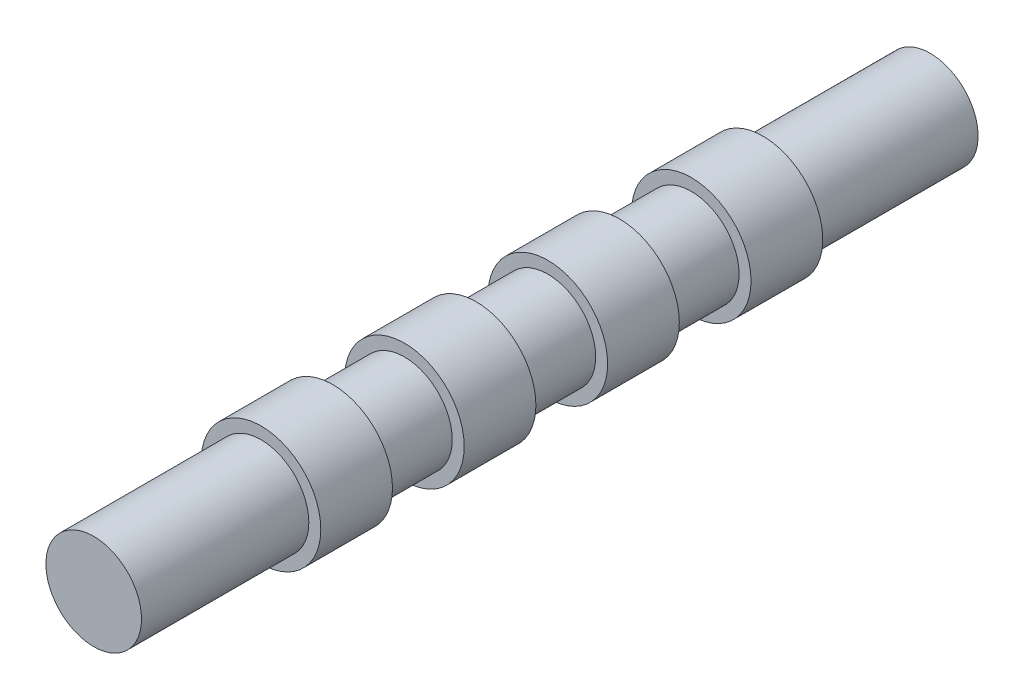
ISO-10303-21;
HEADER;
FILE_DESCRIPTION(('STEP AP214'),'2;1');
FILE_NAME('part.step','',(''),(''),'','','');
FILE_SCHEMA(('AUTOMOTIVE_DESIGN { 1 0 10303 214 1 1 1 1 }'));
ENDSEC;
DATA;
#1=APPLICATION_CONTEXT('core data for automotive mechanical design processes');
#2=APPLICATION_PROTOCOL_DEFINITION('international standard','automotive_design',2000,#1);
#3=PRODUCT_CONTEXT('',#1,'mechanical');
#4=PRODUCT('Part','Part','',(#3));
#5=PRODUCT_RELATED_PRODUCT_CATEGORY('part','',(#4));
#6=PRODUCT_DEFINITION_FORMATION('','',#4);
#7=PRODUCT_DEFINITION_CONTEXT('part definition',#1,'design');
#8=PRODUCT_DEFINITION('design','',#6,#7);
#9=PRODUCT_DEFINITION_SHAPE('','',#8);
#10=(LENGTH_UNIT() NAMED_UNIT(*) SI_UNIT(.MILLI.,.METRE.));
#11=(NAMED_UNIT(*) PLANE_ANGLE_UNIT() SI_UNIT($,.RADIAN.));
#12=(NAMED_UNIT(*) SI_UNIT($,.STERADIAN.) SOLID_ANGLE_UNIT());
#13=UNCERTAINTY_MEASURE_WITH_UNIT(LENGTH_MEASURE(1.E-05),#10,'distance_accuracy_value','');
#14=(GEOMETRIC_REPRESENTATION_CONTEXT(3) GLOBAL_UNCERTAINTY_ASSIGNED_CONTEXT((#13)) GLOBAL_UNIT_ASSIGNED_CONTEXT((#10,
#11,#12)) REPRESENTATION_CONTEXT('',''));
#15=CARTESIAN_POINT('',(0.,0.,0.));
#16=DIRECTION('',(0.,0.,1.));
#17=DIRECTION('',(1.,0.,0.));
#18=AXIS2_PLACEMENT_3D('',#15,#16,#17);
#19=CARTESIAN_POINT('',(0.,0.,175.));
#20=DIRECTION('',(0.,0.,-1.));
#21=DIRECTION('',(-1.,0.,0.));
#22=AXIS2_PLACEMENT_3D('',#19,#20,#21);
#23=CYLINDRICAL_SURFACE('',#22,25.);
#24=CARTESIAN_POINT('',(0.,0.,-15.));
#25=DIRECTION('',(0.,0.,1.));
#26=DIRECTION('',(1.,0.,0.));
#27=AXIS2_PLACEMENT_3D('',#24,#25,#26);
#28=CIRCLE('',#27,25.);
#29=CARTESIAN_POINT('',(25.,0.,-15.));
#30=VERTEX_POINT('',#29);
#31=EDGE_CURVE('E75',#30,#30,#28,.T.);
#32=ORIENTED_EDGE('',*,*,#31,.F.);
#33=EDGE_LOOP('',(#32));
#34=FACE_BOUND('',#33,.T.);
#35=CARTESIAN_POINT('',(0.,0.,-45.));
#36=DIRECTION('',(0.,0.,1.));
#37=DIRECTION('',(1.,0.,0.));
#38=AXIS2_PLACEMENT_3D('',#35,#36,#37);
#39=CIRCLE('',#38,25.);
#40=CARTESIAN_POINT('',(25.,0.,-45.));
#41=VERTEX_POINT('',#40);
#42=EDGE_CURVE('E90',#41,#41,#39,.T.);
#43=ORIENTED_EDGE('',*,*,#42,.T.);
#44=EDGE_LOOP('',(#43));
#45=FACE_BOUND('',#44,.T.);
#46=ADVANCED_FACE('F37',(#34,#45),#23,.T.);
#47=CARTESIAN_POINT('',(0.,0.,45.));
#48=DIRECTION('',(0.,0.,1.));
#49=DIRECTION('',(1.,0.,0.));
#50=AXIS2_PLACEMENT_3D('',#47,#48,#49);
#51=CIRCLE('',#50,25.);
#52=CARTESIAN_POINT('',(25.,0.,45.));
#53=VERTEX_POINT('',#52);
#54=EDGE_CURVE('E61',#53,#53,#51,.T.);
#55=ORIENTED_EDGE('',*,*,#54,.F.);
#56=EDGE_LOOP('',(#55));
#57=FACE_BOUND('',#56,.T.);
#58=CARTESIAN_POINT('',(0.,0.,15.));
#59=DIRECTION('',(0.,0.,1.));
#60=DIRECTION('',(1.,0.,0.));
#61=AXIS2_PLACEMENT_3D('',#58,#59,#60);
#62=CIRCLE('',#61,25.);
#63=CARTESIAN_POINT('',(25.,0.,15.));
#64=VERTEX_POINT('',#63);
#65=EDGE_CURVE('E78',#64,#64,#62,.T.);
#66=ORIENTED_EDGE('',*,*,#65,.T.);
#67=EDGE_LOOP('',(#66));
#68=FACE_BOUND('',#67,.T.);
#69=ADVANCED_FACE('F120',(#57,#68),#23,.T.);
#70=CARTESIAN_POINT('',(0.,0.,105.));
#71=DIRECTION('',(0.,0.,1.));
#72=DIRECTION('',(1.,0.,0.));
#73=AXIS2_PLACEMENT_3D('',#70,#71,#72);
#74=CIRCLE('',#73,25.);
#75=CARTESIAN_POINT('',(25.,0.,105.));
#76=VERTEX_POINT('',#75);
#77=EDGE_CURVE('E11',#76,#76,#74,.T.);
#78=ORIENTED_EDGE('',*,*,#77,.F.);
#79=EDGE_LOOP('',(#78));
#80=FACE_BOUND('',#79,.T.);
#81=CARTESIAN_POINT('',(0.,0.,75.));
#82=DIRECTION('',(0.,0.,1.));
#83=DIRECTION('',(1.,0.,0.));
#84=AXIS2_PLACEMENT_3D('',#81,#82,#83);
#85=CIRCLE('',#84,25.);
#86=CARTESIAN_POINT('',(25.,0.,75.));
#87=VERTEX_POINT('',#86);
#88=EDGE_CURVE('E66',#87,#87,#85,.T.);
#89=ORIENTED_EDGE('',*,*,#88,.T.);
#90=EDGE_LOOP('',(#89));
#91=FACE_BOUND('',#90,.T.);
#92=ADVANCED_FACE('F127',(#80,#91),#23,.T.);
#93=CARTESIAN_POINT('',(0.,0.,105.));
#94=DIRECTION('',(0.,0.,1.));
#95=DIRECTION('',(1.,0.,0.));
#96=AXIS2_PLACEMENT_3D('',#93,#94,#95);
#97=PLANE('',#96);
#98=CARTESIAN_POINT('',(0.,0.,105.));
#99=DIRECTION('',(0.,0.,1.));
#100=DIRECTION('',(1.,0.,0.));
#101=AXIS2_PLACEMENT_3D('',#98,#99,#100);
#102=CIRCLE('',#101,20.);
#103=CARTESIAN_POINT('',(20.,0.,105.));
#104=VERTEX_POINT('',#103);
#105=EDGE_CURVE('E44',#104,#104,#102,.T.);
#106=ORIENTED_EDGE('',*,*,#105,.F.);
#107=EDGE_LOOP('',(#106));
#108=FACE_BOUND('',#107,.T.);
#109=ORIENTED_EDGE('',*,*,#77,.T.);
#110=EDGE_LOOP('',(#109));
#111=FACE_BOUND('',#110,.T.);
#112=ADVANCED_FACE('F144',(#108,#111),#97,.T.);
#113=CARTESIAN_POINT('',(0.,0.,105.));
#114=DIRECTION('',(0.,0.,1.));
#115=DIRECTION('',(1.,0.,0.));
#116=AXIS2_PLACEMENT_3D('',#113,#114,#115);
#117=CYLINDRICAL_SURFACE('',#116,20.);
#118=ORIENTED_EDGE('',*,*,#105,.T.);
#119=EDGE_LOOP('',(#118));
#120=FACE_BOUND('',#119,.T.);
#121=CARTESIAN_POINT('',(0.,0.,175.));
#122=DIRECTION('',(0.,0.,1.));
#123=DIRECTION('',(1.,0.,0.));
#124=AXIS2_PLACEMENT_3D('',#121,#122,#123);
#125=CIRCLE('',#124,20.);
#126=CARTESIAN_POINT('',(20.,0.,175.));
#127=VERTEX_POINT('',#126);
#128=EDGE_CURVE('E48',#127,#127,#125,.T.);
#129=ORIENTED_EDGE('',*,*,#128,.F.);
#130=EDGE_LOOP('',(#129));
#131=FACE_BOUND('',#130,.T.);
#132=ADVANCED_FACE('F151',(#120,#131),#117,.T.);
#133=CARTESIAN_POINT('',(0.,0.,175.));
#134=DIRECTION('',(0.,0.,1.));
#135=DIRECTION('',(1.,0.,0.));
#136=AXIS2_PLACEMENT_3D('',#133,#134,#135);
#137=PLANE('',#136);
#138=ORIENTED_EDGE('',*,*,#128,.T.);
#139=EDGE_LOOP('',(#138));
#140=FACE_BOUND('',#139,.T.);
#141=ADVANCED_FACE('F161',(#140),#137,.T.);
#142=CARTESIAN_POINT('',(0.,0.,75.));
#143=DIRECTION('',(0.,0.,-1.));
#144=DIRECTION('',(-1.,0.,0.));
#145=AXIS2_PLACEMENT_3D('',#142,#143,#144);
#146=PLANE('',#145);
#147=ORIENTED_EDGE('',*,*,#88,.F.);
#148=EDGE_LOOP('',(#147));
#149=FACE_BOUND('',#148,.T.);
#150=CARTESIAN_POINT('',(0.,0.,75.));
#151=DIRECTION('',(0.,0.,1.));
#152=DIRECTION('',(1.,0.,0.));
#153=AXIS2_PLACEMENT_3D('',#150,#151,#152);
#154=CIRCLE('',#153,20.);
#155=CARTESIAN_POINT('',(20.,0.,75.));
#156=VERTEX_POINT('',#155);
#157=EDGE_CURVE('E72',#156,#156,#154,.T.);
#158=ORIENTED_EDGE('',*,*,#157,.T.);
#159=EDGE_LOOP('',(#158));
#160=FACE_BOUND('',#159,.T.);
#161=ADVANCED_FACE('F157',(#149,#160),#146,.T.);
#162=CARTESIAN_POINT('',(0.,0.,45.));
#163=DIRECTION('',(0.,0.,-1.));
#164=DIRECTION('',(-1.,0.,0.));
#165=AXIS2_PLACEMENT_3D('',#162,#163,#164);
#166=PLANE('',#165);
#167=ORIENTED_EDGE('',*,*,#54,.T.);
#168=EDGE_LOOP('',(#167));
#169=FACE_BOUND('',#168,.T.);
#170=CARTESIAN_POINT('',(0.,0.,45.));
#171=DIRECTION('',(0.,0.,1.));
#172=DIRECTION('',(1.,0.,0.));
#173=AXIS2_PLACEMENT_3D('',#170,#171,#172);
#174=CIRCLE('',#173,20.);
#175=CARTESIAN_POINT('',(20.,0.,45.));
#176=VERTEX_POINT('',#175);
#177=EDGE_CURVE('E69',#176,#176,#174,.T.);
#178=ORIENTED_EDGE('',*,*,#177,.F.);
#179=EDGE_LOOP('',(#178));
#180=FACE_BOUND('',#179,.T.);
#181=ADVANCED_FACE('F160',(#169,#180),#166,.F.);
#182=CARTESIAN_POINT('',(0.,0.,75.));
#183=DIRECTION('',(0.,0.,-1.));
#184=DIRECTION('',(-1.,0.,0.));
#185=AXIS2_PLACEMENT_3D('',#182,#183,#184);
#186=CYLINDRICAL_SURFACE('',#185,20.);
#187=ORIENTED_EDGE('',*,*,#157,.F.);
#188=EDGE_LOOP('',(#187));
#189=FACE_BOUND('',#188,.T.);
#190=ORIENTED_EDGE('',*,*,#177,.T.);
#191=EDGE_LOOP('',(#190));
#192=FACE_BOUND('',#191,.T.);
#193=ADVANCED_FACE('F165',(#189,#192),#186,.T.);
#194=CARTESIAN_POINT('',(0.,0.,15.));
#195=DIRECTION('',(0.,0.,-1.));
#196=DIRECTION('',(-1.,0.,0.));
#197=AXIS2_PLACEMENT_3D('',#194,#195,#196);
#198=PLANE('',#197);
#199=ORIENTED_EDGE('',*,*,#65,.F.);
#200=EDGE_LOOP('',(#199));
#201=FACE_BOUND('',#200,.T.);
#202=CARTESIAN_POINT('',(0.,0.,15.));
#203=DIRECTION('',(0.,0.,1.));
#204=DIRECTION('',(1.,0.,0.));
#205=AXIS2_PLACEMENT_3D('',#202,#203,#204);
#206=CIRCLE('',#205,20.);
#207=CARTESIAN_POINT('',(20.,0.,15.));
#208=VERTEX_POINT('',#207);
#209=EDGE_CURVE('E84',#208,#208,#206,.T.);
#210=ORIENTED_EDGE('',*,*,#209,.T.);
#211=EDGE_LOOP('',(#210));
#212=FACE_BOUND('',#211,.T.);
#213=ADVANCED_FACE('F168',(#201,#212),#198,.T.);
#214=CARTESIAN_POINT('',(0.,0.,-15.));
#215=DIRECTION('',(0.,0.,-1.));
#216=DIRECTION('',(-1.,0.,0.));
#217=AXIS2_PLACEMENT_3D('',#214,#215,#216);
#218=PLANE('',#217);
#219=ORIENTED_EDGE('',*,*,#31,.T.);
#220=EDGE_LOOP('',(#219));
#221=FACE_BOUND('',#220,.T.);
#222=CARTESIAN_POINT('',(0.,0.,-15.));
#223=DIRECTION('',(0.,0.,1.));
#224=DIRECTION('',(1.,0.,0.));
#225=AXIS2_PLACEMENT_3D('',#222,#223,#224);
#226=CIRCLE('',#225,20.);
#227=CARTESIAN_POINT('',(20.,0.,-15.));
#228=VERTEX_POINT('',#227);
#229=EDGE_CURVE('E81',#228,#228,#226,.T.);
#230=ORIENTED_EDGE('',*,*,#229,.F.);
#231=EDGE_LOOP('',(#230));
#232=FACE_BOUND('',#231,.T.);
#233=ADVANCED_FACE('F265',(#221,#232),#218,.F.);
#234=CARTESIAN_POINT('',(0.,0.,15.));
#235=DIRECTION('',(0.,0.,-1.));
#236=DIRECTION('',(-1.,0.,0.));
#237=AXIS2_PLACEMENT_3D('',#234,#235,#236);
#238=CYLINDRICAL_SURFACE('',#237,20.);
#239=ORIENTED_EDGE('',*,*,#209,.F.);
#240=EDGE_LOOP('',(#239));
#241=FACE_BOUND('',#240,.T.);
#242=ORIENTED_EDGE('',*,*,#229,.T.);
#243=EDGE_LOOP('',(#242));
#244=FACE_BOUND('',#243,.T.);
#245=ADVANCED_FACE('F116',(#241,#244),#238,.T.);
#246=CARTESIAN_POINT('',(0.,0.,-45.));
#247=DIRECTION('',(0.,0.,-1.));
#248=DIRECTION('',(-1.,0.,0.));
#249=AXIS2_PLACEMENT_3D('',#246,#247,#248);
#250=PLANE('',#249);
#251=ORIENTED_EDGE('',*,*,#42,.F.);
#252=EDGE_LOOP('',(#251));
#253=FACE_BOUND('',#252,.T.);
#254=CARTESIAN_POINT('',(0.,0.,-45.));
#255=DIRECTION('',(0.,0.,1.));
#256=DIRECTION('',(1.,0.,0.));
#257=AXIS2_PLACEMENT_3D('',#254,#255,#256);
#258=CIRCLE('',#257,20.);
#259=CARTESIAN_POINT('',(20.,0.,-45.));
#260=VERTEX_POINT('',#259);
#261=EDGE_CURVE('E96',#260,#260,#258,.T.);
#262=ORIENTED_EDGE('',*,*,#261,.T.);
#263=EDGE_LOOP('',(#262));
#264=FACE_BOUND('',#263,.T.);
#265=ADVANCED_FACE('F100',(#253,#264),#250,.T.);
#266=CARTESIAN_POINT('',(0.,0.,-75.));
#267=DIRECTION('',(0.,0.,-1.));
#268=DIRECTION('',(-1.,0.,0.));
#269=AXIS2_PLACEMENT_3D('',#266,#267,#268);
#270=PLANE('',#269);
#271=CARTESIAN_POINT('',(0.,0.,-75.));
#272=DIRECTION('',(0.,0.,1.));
#273=DIRECTION('',(1.,0.,0.));
#274=AXIS2_PLACEMENT_3D('',#271,#272,#273);
#275=CIRCLE('',#274,25.);
#276=CARTESIAN_POINT('',(25.,0.,-75.));
#277=VERTEX_POINT('',#276);
#278=EDGE_CURVE('E87',#277,#277,#275,.T.);
#279=ORIENTED_EDGE('',*,*,#278,.T.);
#280=EDGE_LOOP('',(#279));
#281=FACE_BOUND('',#280,.T.);
#282=CARTESIAN_POINT('',(0.,0.,-75.));
#283=DIRECTION('',(0.,0.,1.));
#284=DIRECTION('',(1.,0.,0.));
#285=AXIS2_PLACEMENT_3D('',#282,#283,#284);
#286=CIRCLE('',#285,20.);
#287=CARTESIAN_POINT('',(20.,0.,-75.));
#288=VERTEX_POINT('',#287);
#289=EDGE_CURVE('E93',#288,#288,#286,.T.);
#290=ORIENTED_EDGE('',*,*,#289,.F.);
#291=EDGE_LOOP('',(#290));
#292=FACE_BOUND('',#291,.T.);
#293=ADVANCED_FACE('F106',(#281,#292),#270,.F.);
#294=CARTESIAN_POINT('',(0.,0.,-45.));
#295=DIRECTION('',(0.,0.,-1.));
#296=DIRECTION('',(-1.,0.,0.));
#297=AXIS2_PLACEMENT_3D('',#294,#295,#296);
#298=CYLINDRICAL_SURFACE('',#297,20.);
#299=ORIENTED_EDGE('',*,*,#261,.F.);
#300=EDGE_LOOP('',(#299));
#301=FACE_BOUND('',#300,.T.);
#302=ORIENTED_EDGE('',*,*,#289,.T.);
#303=EDGE_LOOP('',(#302));
#304=FACE_BOUND('',#303,.T.);
#305=ADVANCED_FACE('F102',(#301,#304),#298,.T.);
#306=CARTESIAN_POINT('',(0.,0.,-175.));
#307=DIRECTION('',(0.,0.,1.));
#308=DIRECTION('',(1.,0.,0.));
#309=AXIS2_PLACEMENT_3D('',#306,#307,#308);
#310=PLANE('',#309);
#311=CARTESIAN_POINT('',(0.,0.,-175.));
#312=DIRECTION('',(0.,0.,-1.));
#313=DIRECTION('',(-1.,0.,0.));
#314=AXIS2_PLACEMENT_3D('',#311,#312,#313);
#315=CIRCLE('',#314,20.);
#316=CARTESIAN_POINT('',(-20.,0.,-175.));
#317=VERTEX_POINT('',#316);
#318=EDGE_CURVE('E58',#317,#317,#315,.T.);
#319=ORIENTED_EDGE('',*,*,#318,.T.);
#320=EDGE_LOOP('',(#319));
#321=FACE_BOUND('',#320,.T.);
#322=ADVANCED_FACE('F105',(#321),#310,.F.);
#323=CARTESIAN_POINT('',(0.,0.,-105.));
#324=DIRECTION('',(0.,0.,-1.));
#325=DIRECTION('',(-1.,0.,0.));
#326=AXIS2_PLACEMENT_3D('',#323,#324,#325);
#327=CYLINDRICAL_SURFACE('',#326,20.);
#328=CARTESIAN_POINT('',(0.,0.,-105.));
#329=DIRECTION('',(0.,0.,-1.));
#330=DIRECTION('',(-1.,0.,0.));
#331=AXIS2_PLACEMENT_3D('',#328,#329,#330);
#332=CIRCLE('',#331,20.);
#333=CARTESIAN_POINT('',(-20.,0.,-105.));
#334=VERTEX_POINT('',#333);
#335=EDGE_CURVE('E57',#334,#334,#332,.T.);
#336=ORIENTED_EDGE('',*,*,#335,.T.);
#337=EDGE_LOOP('',(#336));
#338=FACE_BOUND('',#337,.T.);
#339=ORIENTED_EDGE('',*,*,#318,.F.);
#340=EDGE_LOOP('',(#339));
#341=FACE_BOUND('',#340,.T.);
#342=ADVANCED_FACE('F138',(#338,#341),#327,.T.);
#343=CARTESIAN_POINT('',(0.,0.,-105.));
#344=DIRECTION('',(0.,0.,-1.));
#345=DIRECTION('',(-1.,0.,0.));
#346=AXIS2_PLACEMENT_3D('',#343,#344,#345);
#347=PLANE('',#346);
#348=ORIENTED_EDGE('',*,*,#335,.F.);
#349=EDGE_LOOP('',(#348));
#350=FACE_BOUND('',#349,.T.);
#351=CARTESIAN_POINT('',(0.,0.,-105.));
#352=DIRECTION('',(0.,0.,-1.));
#353=DIRECTION('',(-1.,0.,0.));
#354=AXIS2_PLACEMENT_3D('',#351,#352,#353);
#355=CIRCLE('',#354,25.);
#356=CARTESIAN_POINT('',(-25.,0.,-105.));
#357=VERTEX_POINT('',#356);
#358=EDGE_CURVE('E53',#357,#357,#355,.T.);
#359=ORIENTED_EDGE('',*,*,#358,.T.);
#360=EDGE_LOOP('',(#359));
#361=FACE_BOUND('',#360,.T.);
#362=ADVANCED_FACE('F132',(#350,#361),#347,.T.);
#363=ORIENTED_EDGE('',*,*,#278,.F.);
#364=EDGE_LOOP('',(#363));
#365=FACE_BOUND('',#364,.T.);
#366=ORIENTED_EDGE('',*,*,#358,.F.);
#367=EDGE_LOOP('',(#366));
#368=FACE_BOUND('',#367,.T.);
#369=ADVANCED_FACE('F39',(#365,#368),#23,.T.);
#370=CLOSED_SHELL('',(#46,#69,#92,#112,#132,#141,#161,#181,#193,#213,#233,#245,#265,#293,#305,
#322,#342,#362,#369));
#371=MANIFOLD_SOLID_BREP('B2',#370);
#372=ADVANCED_BREP_SHAPE_REPRESENTATION('',(#18,#371),#14);
#373=SHAPE_DEFINITION_REPRESENTATION(#9,#372);
ENDSEC;
END-ISO-10303-21;
